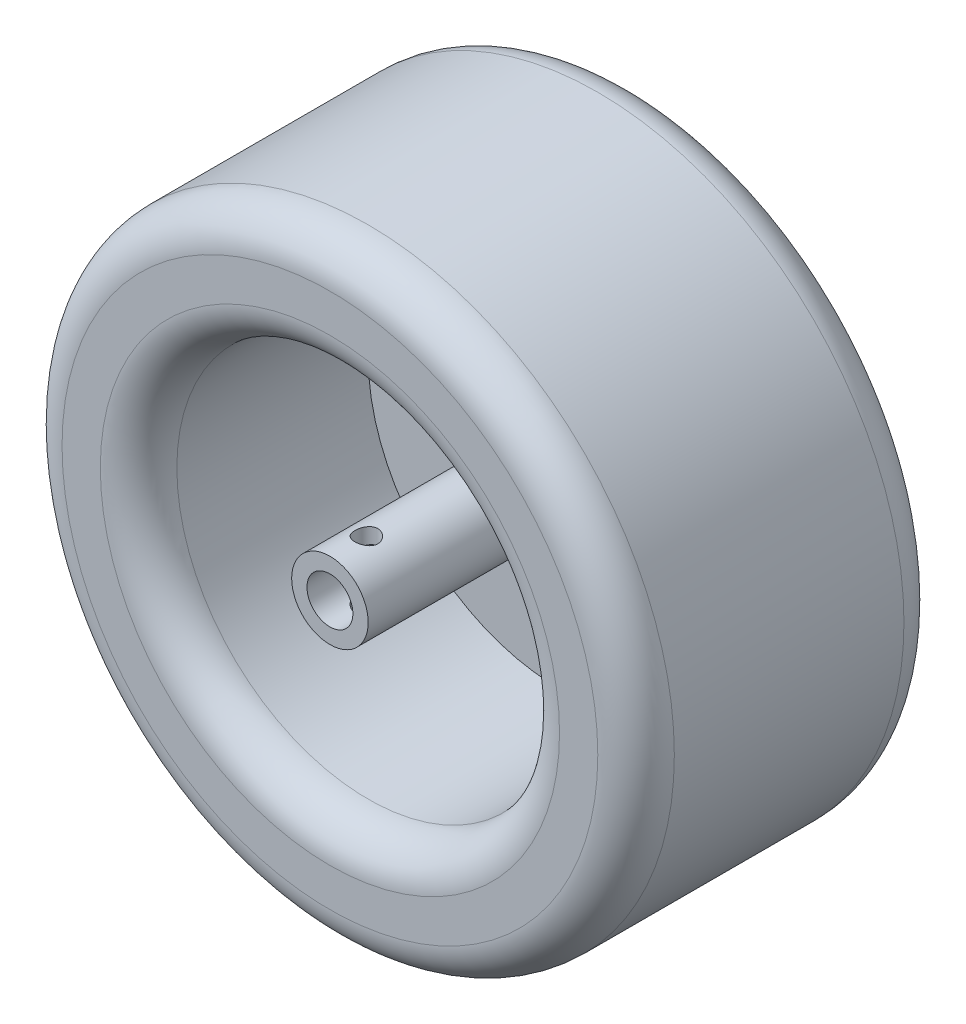
ISO-10303-21;
HEADER;
FILE_DESCRIPTION(('STEP AP214'),'2;1');
FILE_NAME('part.step','',(''),(''),'','','');
FILE_SCHEMA(('AUTOMOTIVE_DESIGN { 1 0 10303 214 1 1 1 1 }'));
ENDSEC;
DATA;
#1=APPLICATION_CONTEXT('core data for automotive mechanical design processes');
#2=APPLICATION_PROTOCOL_DEFINITION('international standard','automotive_design',2000,#1);
#3=PRODUCT_CONTEXT('',#1,'mechanical');
#4=PRODUCT('Part','Part','',(#3));
#5=PRODUCT_RELATED_PRODUCT_CATEGORY('part','',(#4));
#6=PRODUCT_DEFINITION_FORMATION('','',#4);
#7=PRODUCT_DEFINITION_CONTEXT('part definition',#1,'design');
#8=PRODUCT_DEFINITION('design','',#6,#7);
#9=PRODUCT_DEFINITION_SHAPE('','',#8);
#10=(LENGTH_UNIT() NAMED_UNIT(*) SI_UNIT(.MILLI.,.METRE.));
#11=(NAMED_UNIT(*) PLANE_ANGLE_UNIT() SI_UNIT($,.RADIAN.));
#12=(NAMED_UNIT(*) SI_UNIT($,.STERADIAN.) SOLID_ANGLE_UNIT());
#13=UNCERTAINTY_MEASURE_WITH_UNIT(LENGTH_MEASURE(1.E-05),#10,'distance_accuracy_value','');
#14=(GEOMETRIC_REPRESENTATION_CONTEXT(3) GLOBAL_UNCERTAINTY_ASSIGNED_CONTEXT((#13)) GLOBAL_UNIT_ASSIGNED_CONTEXT((#10,
#11,#12)) REPRESENTATION_CONTEXT('',''));
#15=CARTESIAN_POINT('',(0.,0.,0.));
#16=DIRECTION('',(0.,0.,1.));
#17=DIRECTION('',(1.,0.,0.));
#18=AXIS2_PLACEMENT_3D('',#15,#16,#17);
#19=CARTESIAN_POINT('',(0.,0.,35.));
#20=DIRECTION('',(0.,0.,-1.));
#21=DIRECTION('',(-1.,0.,0.));
#22=AXIS2_PLACEMENT_3D('',#19,#20,#21);
#23=CYLINDRICAL_SURFACE('',#22,5.);
#24=CARTESIAN_POINT('',(0.,0.,35.));
#25=DIRECTION('',(0.,0.,1.));
#26=DIRECTION('',(1.,0.,0.));
#27=AXIS2_PLACEMENT_3D('',#24,#25,#26);
#28=CIRCLE('',#27,5.);
#29=CARTESIAN_POINT('',(5.,0.,35.));
#30=VERTEX_POINT('',#29);
#31=EDGE_CURVE('E147',#30,#30,#28,.T.);
#32=ORIENTED_EDGE('',*,*,#31,.F.);
#33=EDGE_LOOP('',(#32));
#34=FACE_BOUND('',#33,.T.);
#35=CARTESIAN_POINT('',(0.,0.,5.));
#36=DIRECTION('',(0.,0.,-1.));
#37=DIRECTION('',(-1.,0.,0.));
#38=AXIS2_PLACEMENT_3D('',#35,#36,#37);
#39=CIRCLE('',#38,5.);
#40=CARTESIAN_POINT('',(-5.,0.,5.));
#41=VERTEX_POINT('',#40);
#42=EDGE_CURVE('E152',#41,#41,#39,.F.);
#43=ORIENTED_EDGE('',*,*,#42,.T.);
#44=EDGE_LOOP('',(#43));
#45=FACE_BOUND('',#44,.T.);
#46=CARTESIAN_POINT('',(0.,-5.,28.7430607778996));
#47=CARTESIAN_POINT('',(0.0822886127532998,-4.9999992925055,28.7430617753845));
#48=CARTESIAN_POINT('',(0.164587318351529,-4.99794915693954,28.7498546415236));
#49=CARTESIAN_POINT('',(0.32678812530488,-4.98997105593691,28.7767821321217));
#50=CARTESIAN_POINT('',(0.406689504411419,-4.98404193389692,28.796920735923));
#51=CARTESIAN_POINT('',(0.561732707754526,-4.96895552501836,28.8498067948099));
#52=CARTESIAN_POINT('',(0.636881364395373,-4.95980300250425,28.8825356475186));
#53=CARTESIAN_POINT('',(0.780624181053131,-4.93922109237645,28.9595968709555));
#54=CARTESIAN_POINT('',(0.849217467469668,-4.92779140192067,29.003930785295));
#55=CARTESIAN_POINT('',(0.979871797183743,-4.90350737192774,29.1042847853723));
#56=CARTESIAN_POINT('',(1.04171807124434,-4.89062383657036,29.1605774037855));
#57=CARTESIAN_POINT('',(1.15524920923324,-4.86505834210442,29.2826700078098));
#58=CARTESIAN_POINT('',(1.20693236327441,-4.85237641724501,29.3484715900246));
#59=CARTESIAN_POINT('',(1.29980037723708,-4.82834113993772,29.4895315309372));
#60=CARTESIAN_POINT('',(1.34072309022213,-4.81702406663875,29.5649692388904));
#61=CARTESIAN_POINT('',(1.4092139477476,-4.79743620394031,29.7220500321299));
#62=CARTESIAN_POINT('',(1.43678529919973,-4.78916468313311,29.8036916218276));
#63=CARTESIAN_POINT('',(1.47701633682652,-4.77690870838434,29.9684510440301));
#64=CARTESIAN_POINT('',(1.49007196234677,-4.77281069324533,30.0514635217636));
#65=CARTESIAN_POINT('',(1.50213730614672,-4.76902789749767,30.2185939341164));
#66=CARTESIAN_POINT('',(1.50115042761078,-4.76934204760571,30.3027115959587));
#67=CARTESIAN_POINT('',(1.48546977199812,-4.77424744067778,30.4664446865081));
#68=CARTESIAN_POINT('',(1.47127205262685,-4.7786838859914,30.5461130282619));
#69=CARTESIAN_POINT('',(1.43037420427056,-4.79108356228624,30.7018805641731));
#70=CARTESIAN_POINT('',(1.40367284141641,-4.79904714132351,30.777979405274));
#71=CARTESIAN_POINT('',(1.33816026653682,-4.81772733074973,30.9256611275604));
#72=CARTESIAN_POINT('',(1.29918816934642,-4.82848016115952,30.9971678618549));
#73=CARTESIAN_POINT('',(1.21035222588683,-4.85150987000065,31.1327927999098));
#74=CARTESIAN_POINT('',(1.16048574002588,-4.86378711746991,31.1969092073134));
#75=CARTESIAN_POINT('',(1.04881290765546,-4.88911011297937,31.3187469686616));
#76=CARTESIAN_POINT('',(0.986594907466972,-4.90216654310498,31.3760894419293));
#77=CARTESIAN_POINT('',(0.853263259313969,-4.92712244063259,31.4796147619639));
#78=CARTESIAN_POINT('',(0.782149051860891,-4.9390218351841,31.5257969063141));
#79=CARTESIAN_POINT('',(0.632355038342807,-4.9604316006947,31.6059207003644));
#80=CARTESIAN_POINT('',(0.553627749747954,-4.96992543668314,31.6397782941495));
#81=CARTESIAN_POINT('',(0.391245415603522,-4.98533521832222,31.6936603679993));
#82=CARTESIAN_POINT('',(0.307591751589583,-4.99125216186999,31.7136887064321));
#83=CARTESIAN_POINT('',(0.140952242668331,-4.99868364643538,31.738712955799));
#84=CARTESIAN_POINT('',(0.0580500976011863,-5.0003485041779,31.7442223637012));
#85=CARTESIAN_POINT('',(-0.107499605823384,-4.9995292324176,31.7414916221875));
#86=CARTESIAN_POINT('',(-0.190147196690781,-4.99704565677756,31.7332533082482));
#87=CARTESIAN_POINT('',(-0.350903605309697,-4.98830696987163,31.7036761667881));
#88=CARTESIAN_POINT('',(-0.42907277261417,-4.98213829799417,31.6826373903188));
#89=CARTESIAN_POINT('',(-0.580754638954523,-4.96674347841532,31.6284175451214));
#90=CARTESIAN_POINT('',(-0.654266777025584,-4.95751696321085,31.5952350168618));
#91=CARTESIAN_POINT('',(-0.796437189461053,-4.93669654351325,31.5168076124185));
#92=CARTESIAN_POINT('',(-0.864943826199672,-4.92505280829675,31.4713014369516));
#93=CARTESIAN_POINT('',(-0.993523307980149,-4.90073468764318,31.3698360238468));
#94=CARTESIAN_POINT('',(-1.05359403235593,-4.8880600443108,31.313874166012));
#95=CARTESIAN_POINT('',(-1.16585744551027,-4.86253171869138,31.1906734695303));
#96=CARTESIAN_POINT('',(-1.21768481231504,-4.84968825033268,31.1230989021279));
#97=CARTESIAN_POINT('',(-1.30928995072154,-4.82576515238463,30.9799328388861));
#98=CARTESIAN_POINT('',(-1.34906803829472,-4.81468547654651,30.9043415533414));
#99=CARTESIAN_POINT('',(-1.41517347127168,-4.79567189615055,30.7475282866449));
#100=CARTESIAN_POINT('',(-1.4415634693705,-4.78772337843827,30.666334591363));
#101=CARTESIAN_POINT('',(-1.48021730815114,-4.77591594362794,30.5003728089681));
#102=CARTESIAN_POINT('',(-1.49248598978779,-4.772055625083,30.415605957112));
#103=CARTESIAN_POINT('',(-1.50221984485059,-4.76899972496087,30.2486992595234));
#104=CARTESIAN_POINT('',(-1.5002805530849,-4.76961647442754,30.166597126882));
#105=CARTESIAN_POINT('',(-1.48307505444813,-4.77499401288294,30.0039466745268));
#106=CARTESIAN_POINT('',(-1.46780938124716,-4.77975463592551,29.9233982927233));
#107=CARTESIAN_POINT('',(-1.42476888804136,-4.79275763670385,29.7671153787568));
#108=CARTESIAN_POINT('',(-1.39715175507069,-4.80095604545965,29.6913334905379));
#109=CARTESIAN_POINT('',(-1.33031507121129,-4.81990278909136,29.5454183390819));
#110=CARTESIAN_POINT('',(-1.29109329962876,-4.83065161194312,29.4752861602589));
#111=CARTESIAN_POINT('',(-1.20048763805072,-4.85397676425833,29.3398976613725));
#112=CARTESIAN_POINT('',(-1.14871276092994,-4.86660540163797,29.2749120166392));
#113=CARTESIAN_POINT('',(-1.03517434629782,-4.89201320450026,29.1543582795918));
#114=CARTESIAN_POINT('',(-0.973408217134503,-4.90479240823905,29.0987926384319));
#115=CARTESIAN_POINT('',(-0.83946576218325,-4.92950936570649,28.9970373656046));
#116=CARTESIAN_POINT('',(-0.767037885790609,-4.94141159765674,28.9511693310441));
#117=CARTESIAN_POINT('',(-0.615141373983531,-4.96260680455813,28.8723256079956));
#118=CARTESIAN_POINT('',(-0.535676052998956,-4.97190099931067,28.8393438896251));
#119=CARTESIAN_POINT('',(-0.380757712655282,-4.98602174969301,28.7901655022469));
#120=CARTESIAN_POINT('',(-0.305786961954234,-4.99122027381068,28.7725491050164));
#121=CARTESIAN_POINT('',(-0.15388019523078,-4.99820944494492,28.7489972526581));
#122=CARTESIAN_POINT('',(-0.0769445098581397,-5.0000006615474,28.7430598451948));
#123=CARTESIAN_POINT('',(0.,-5.,28.7430607778996));
#124=B_SPLINE_CURVE_WITH_KNOTS('',3,(#46,#47,#48,#49,#50,#51,#52,#53,#54,#55,#56,#57,#58,#59,
#60,#61,#62,#63,#64,#65,#66,#67,#68,#69,#70,#71,#72,#73,#74,#75,#76,#77,#78,#79,#80,#81,#82,#83,
#84,#85,#86,#87,#88,#89,#90,#91,#92,#93,#94,#95,#96,#97,#98,#99,#100,#101,#102,#103,#104,#105,
#106,#107,#108,#109,#110,#111,#112,#113,#114,#115,#116,#117,#118,#119,#120,#121,#122,#123),
.UNSPECIFIED.,.T.,.F.,(4,2,2,2,2,2,2,2,2,2,2,2,2,2,2,2,2,2,2,2,2,2,2,2,2,2,2,2,2,2,2,2,2,2,2,2,
2,2,4),(0.,0.24658320361261,0.493239964845999,0.739533676300874,0.985860164412701,
1.23855602948191,1.49129437288633,1.74971481004109,2.00807314543224,2.25919689356599,
2.51025978319089,2.75226016697676,2.99428443658001,3.2396242644712,3.48502360158556,
3.74067104048167,3.99633456531071,4.25371046881688,4.51101453528808,4.75908809438545,
5.00712853550327,5.24956746682327,5.49203554593729,5.74011305702909,5.98825282000191,
6.24540400322819,6.5025484425268,6.75847814951252,7.01432009460283,7.25950155466943,
7.504673196616,7.74680040402721,7.98897397553107,8.2399692567993,8.49102974897502,
8.74942996156671,9.00770911595235,9.2383169193046,9.46888616948875),.UNSPECIFIED.);
#125=CARTESIAN_POINT('',(0.,-5.,28.7430607778996));
#126=VERTEX_POINT('',#125);
#127=EDGE_CURVE('E87',#126,#126,#124,.T.);
#128=ORIENTED_EDGE('',*,*,#127,.F.);
#129=EDGE_LOOP('',(#128));
#130=FACE_BOUND('',#129,.T.);
#131=CARTESIAN_POINT('',(0.,5.,28.7430607778996));
#132=CARTESIAN_POINT('',(-0.0822886127532998,4.9999992925055,28.7430617753845));
#133=CARTESIAN_POINT('',(-0.164587318351529,4.99794915693954,28.7498546415236));
#134=CARTESIAN_POINT('',(-0.32678812530488,4.98997105593691,28.7767821321217));
#135=CARTESIAN_POINT('',(-0.406689504411419,4.98404193389692,28.796920735923));
#136=CARTESIAN_POINT('',(-0.561732707754526,4.96895552501836,28.8498067948099));
#137=CARTESIAN_POINT('',(-0.636881364395373,4.95980300250425,28.8825356475186));
#138=CARTESIAN_POINT('',(-0.780624181053131,4.93922109237645,28.9595968709555));
#139=CARTESIAN_POINT('',(-0.849217467469668,4.92779140192067,29.003930785295));
#140=CARTESIAN_POINT('',(-0.979871797183743,4.90350737192774,29.1042847853723));
#141=CARTESIAN_POINT('',(-1.04171807124434,4.89062383657036,29.1605774037855));
#142=CARTESIAN_POINT('',(-1.15524920923324,4.86505834210442,29.2826700078098));
#143=CARTESIAN_POINT('',(-1.20693236327441,4.85237641724501,29.3484715900246));
#144=CARTESIAN_POINT('',(-1.29980037723708,4.82834113993772,29.4895315309372));
#145=CARTESIAN_POINT('',(-1.34072309022213,4.81702406663875,29.5649692388904));
#146=CARTESIAN_POINT('',(-1.4092139477476,4.79743620394031,29.7220500321299));
#147=CARTESIAN_POINT('',(-1.43678529919973,4.78916468313311,29.8036916218276));
#148=CARTESIAN_POINT('',(-1.47701633682652,4.77690870838434,29.9684510440301));
#149=CARTESIAN_POINT('',(-1.49007196234677,4.77281069324533,30.0514635217636));
#150=CARTESIAN_POINT('',(-1.50213730614672,4.76902789749767,30.2185939341164));
#151=CARTESIAN_POINT('',(-1.50115042761078,4.76934204760571,30.3027115959587));
#152=CARTESIAN_POINT('',(-1.48546977199812,4.77424744067778,30.4664446865081));
#153=CARTESIAN_POINT('',(-1.47127205262685,4.7786838859914,30.5461130282619));
#154=CARTESIAN_POINT('',(-1.43037420427056,4.79108356228624,30.7018805641731));
#155=CARTESIAN_POINT('',(-1.40367284141641,4.79904714132351,30.777979405274));
#156=CARTESIAN_POINT('',(-1.33816026653682,4.81772733074973,30.9256611275604));
#157=CARTESIAN_POINT('',(-1.29918816934642,4.82848016115952,30.9971678618549));
#158=CARTESIAN_POINT('',(-1.21035222588683,4.85150987000065,31.1327927999098));
#159=CARTESIAN_POINT('',(-1.16048574002588,4.86378711746991,31.1969092073134));
#160=CARTESIAN_POINT('',(-1.04881290765546,4.88911011297937,31.3187469686616));
#161=CARTESIAN_POINT('',(-0.986594907466972,4.90216654310498,31.3760894419293));
#162=CARTESIAN_POINT('',(-0.853263259313969,4.92712244063259,31.4796147619639));
#163=CARTESIAN_POINT('',(-0.782149051860891,4.9390218351841,31.5257969063141));
#164=CARTESIAN_POINT('',(-0.632355038342807,4.9604316006947,31.6059207003644));
#165=CARTESIAN_POINT('',(-0.553627749747954,4.96992543668314,31.6397782941495));
#166=CARTESIAN_POINT('',(-0.391245415603522,4.98533521832222,31.6936603679993));
#167=CARTESIAN_POINT('',(-0.307591751589583,4.99125216186999,31.7136887064321));
#168=CARTESIAN_POINT('',(-0.140952242668331,4.99868364643538,31.738712955799));
#169=CARTESIAN_POINT('',(-0.0580500976011863,5.0003485041779,31.7442223637012));
#170=CARTESIAN_POINT('',(0.107499605823384,4.9995292324176,31.7414916221875));
#171=CARTESIAN_POINT('',(0.190147196690781,4.99704565677756,31.7332533082482));
#172=CARTESIAN_POINT('',(0.350903605309697,4.98830696987163,31.7036761667881));
#173=CARTESIAN_POINT('',(0.42907277261417,4.98213829799417,31.6826373903188));
#174=CARTESIAN_POINT('',(0.580754638954523,4.96674347841532,31.6284175451214));
#175=CARTESIAN_POINT('',(0.654266777025584,4.95751696321085,31.5952350168618));
#176=CARTESIAN_POINT('',(0.796437189461053,4.93669654351325,31.5168076124185));
#177=CARTESIAN_POINT('',(0.864943826199672,4.92505280829675,31.4713014369516));
#178=CARTESIAN_POINT('',(0.993523307980149,4.90073468764318,31.3698360238468));
#179=CARTESIAN_POINT('',(1.05359403235593,4.8880600443108,31.313874166012));
#180=CARTESIAN_POINT('',(1.16585744551027,4.86253171869138,31.1906734695303));
#181=CARTESIAN_POINT('',(1.21768481231504,4.84968825033268,31.1230989021279));
#182=CARTESIAN_POINT('',(1.30928995072154,4.82576515238463,30.9799328388861));
#183=CARTESIAN_POINT('',(1.34906803829472,4.81468547654651,30.9043415533414));
#184=CARTESIAN_POINT('',(1.41517347127168,4.79567189615055,30.7475282866449));
#185=CARTESIAN_POINT('',(1.4415634693705,4.78772337843827,30.666334591363));
#186=CARTESIAN_POINT('',(1.48021730815114,4.77591594362794,30.5003728089681));
#187=CARTESIAN_POINT('',(1.49248598978779,4.772055625083,30.415605957112));
#188=CARTESIAN_POINT('',(1.50221984485059,4.76899972496087,30.2486992595234));
#189=CARTESIAN_POINT('',(1.5002805530849,4.76961647442754,30.166597126882));
#190=CARTESIAN_POINT('',(1.48307505444813,4.77499401288294,30.0039466745268));
#191=CARTESIAN_POINT('',(1.46780938124716,4.77975463592551,29.9233982927233));
#192=CARTESIAN_POINT('',(1.42476888804136,4.79275763670385,29.7671153787568));
#193=CARTESIAN_POINT('',(1.39715175507069,4.80095604545965,29.6913334905379));
#194=CARTESIAN_POINT('',(1.33031507121129,4.81990278909136,29.5454183390819));
#195=CARTESIAN_POINT('',(1.29109329962876,4.83065161194312,29.4752861602589));
#196=CARTESIAN_POINT('',(1.20048763805072,4.85397676425833,29.3398976613725));
#197=CARTESIAN_POINT('',(1.14871276092994,4.86660540163797,29.2749120166392));
#198=CARTESIAN_POINT('',(1.03517434629782,4.89201320450026,29.1543582795918));
#199=CARTESIAN_POINT('',(0.973408217134503,4.90479240823905,29.0987926384319));
#200=CARTESIAN_POINT('',(0.83946576218325,4.92950936570649,28.9970373656046));
#201=CARTESIAN_POINT('',(0.767037885790609,4.94141159765674,28.9511693310441));
#202=CARTESIAN_POINT('',(0.615141373983531,4.96260680455813,28.8723256079956));
#203=CARTESIAN_POINT('',(0.535676052998956,4.97190099931067,28.8393438896251));
#204=CARTESIAN_POINT('',(0.380757712655282,4.98602174969301,28.7901655022469));
#205=CARTESIAN_POINT('',(0.305786961954234,4.99122027381068,28.7725491050164));
#206=CARTESIAN_POINT('',(0.15388019523078,4.99820944494492,28.7489972526581));
#207=CARTESIAN_POINT('',(0.0769445098581397,5.0000006615474,28.7430598451948));
#208=CARTESIAN_POINT('',(0.,5.,28.7430607778996));
#209=B_SPLINE_CURVE_WITH_KNOTS('',3,(#131,#132,#133,#134,#135,#136,#137,#138,#139,#140,#141,
#142,#143,#144,#145,#146,#147,#148,#149,#150,#151,#152,#153,#154,#155,#156,#157,#158,#159,#160,
#161,#162,#163,#164,#165,#166,#167,#168,#169,#170,#171,#172,#173,#174,#175,#176,#177,#178,#179,
#180,#181,#182,#183,#184,#185,#186,#187,#188,#189,#190,#191,#192,#193,#194,#195,#196,#197,#198,
#199,#200,#201,#202,#203,#204,#205,#206,#207,#208),.UNSPECIFIED.,.T.,.F.,(4,2,2,2,2,2,2,2,2,2,2,
2,2,2,2,2,2,2,2,2,2,2,2,2,2,2,2,2,2,2,2,2,2,2,2,2,2,2,4),(0.,0.24658320361261,0.493239964845999,
0.739533676300874,0.985860164412701,1.23855602948191,1.49129437288633,1.74971481004109,
2.00807314543224,2.25919689356599,2.51025978319089,2.75226016697676,2.99428443658001,
3.2396242644712,3.48502360158556,3.74067104048167,3.99633456531071,4.25371046881688,
4.51101453528808,4.75908809438545,5.00712853550327,5.24956746682327,5.49203554593729,
5.74011305702909,5.98825282000191,6.24540400322819,6.5025484425268,6.75847814951252,
7.01432009460283,7.25950155466943,7.504673196616,7.74680040402721,7.98897397553107,
8.2399692567993,8.49102974897502,8.74942996156671,9.00770911595235,9.2383169193046,
9.46888616948875),.UNSPECIFIED.);
#210=CARTESIAN_POINT('',(0.,5.,28.7430607778996));
#211=VERTEX_POINT('',#210);
#212=EDGE_CURVE('E67',#211,#211,#209,.T.);
#213=ORIENTED_EDGE('',*,*,#212,.F.);
#214=EDGE_LOOP('',(#213));
#215=FACE_BOUND('',#214,.T.);
#216=ADVANCED_FACE('F39',(#34,#45,#130,#215),#23,.T.);
#217=CARTESIAN_POINT('',(0.,0.,35.));
#218=DIRECTION('',(0.,0.,-1.));
#219=DIRECTION('',(-1.,0.,0.));
#220=AXIS2_PLACEMENT_3D('',#217,#218,#219);
#221=CYLINDRICAL_SURFACE('',#220,3.);
#222=CARTESIAN_POINT('',(0.,-3.,28.7430607778996));
#223=CARTESIAN_POINT('',(0.0788579444268501,-2.99999570107562,28.7430657313754));
#224=CARTESIAN_POINT('',(0.157809899546344,-2.99685736529635,28.7493158875812));
#225=CARTESIAN_POINT('',(0.313380352903344,-2.98461234055736,28.7740400984119));
#226=CARTESIAN_POINT('',(0.389994130070444,-2.97549431743379,28.7925373673963));
#227=CARTESIAN_POINT('',(0.538400317320673,-2.95224419105063,28.8408514908246));
#228=CARTESIAN_POINT('',(0.610210204408719,-2.93813158766306,28.8706243542716));
#229=CARTESIAN_POINT('',(0.747708925209897,-2.90618664773642,28.9404167099471));
#230=CARTESIAN_POINT('',(0.813398240985088,-2.88835460450288,28.9804353942729));
#231=CARTESIAN_POINT('',(0.941261726642864,-2.84934387387093,29.0723366521276));
#232=CARTESIAN_POINT('',(1.00298281668316,-2.82802798691306,29.1247904967591));
#233=CARTESIAN_POINT('',(1.11716916730047,-2.78489955370115,29.2388429967702));
#234=CARTESIAN_POINT('',(1.16962737466015,-2.76308664313552,29.3004485555583));
#235=CARTESIAN_POINT('',(1.26787800067542,-2.71948426796021,29.4367858021847));
#236=CARTESIAN_POINT('',(1.31283800332746,-2.69782780455198,29.5121649254185));
#237=CARTESIAN_POINT('',(1.38925234033604,-2.65928968158481,29.6706117818789));
#238=CARTESIAN_POINT('',(1.4207163224495,-2.64240461410484,29.7536739709838));
#239=CARTESIAN_POINT('',(1.46719866328288,-2.61686800556713,29.9200584360325));
#240=CARTESIAN_POINT('',(1.48308878562066,-2.6077840737557,30.0030674560007));
#241=CARTESIAN_POINT('',(1.50064048996327,-2.59772834922792,30.1710290345688));
#242=CARTESIAN_POINT('',(1.50231613255961,-2.59674854014932,30.2559795892064));
#243=CARTESIAN_POINT('',(1.49203093075844,-2.60266395385873,30.4144898143727));
#244=CARTESIAN_POINT('',(1.48167683930523,-2.6086314549302,30.4881968247342));
#245=CARTESIAN_POINT('',(1.4504097735854,-2.62614343100776,30.6326436419592));
#246=CARTESIAN_POINT('',(1.42949343584648,-2.63768968247665,30.7033824958576));
#247=CARTESIAN_POINT('',(1.37731467057901,-2.66531214619112,30.8419044767481));
#248=CARTESIAN_POINT('',(1.34582260067399,-2.68148760995998,30.9095803760783));
#249=CARTESIAN_POINT('',(1.273562531502,-2.71655106422106,31.0390122167846));
#250=CARTESIAN_POINT('',(1.2327903657187,-2.73544027170286,31.1007654812998));
#251=CARTESIAN_POINT('',(1.13709908236918,-2.77669736854929,31.2248426570145));
#252=CARTESIAN_POINT('',(1.08104168755392,-2.79920265355119,31.2862460882639));
#253=CARTESIAN_POINT('',(0.95933336811206,-2.84321434950611,31.399163905786));
#254=CARTESIAN_POINT('',(0.893677884861427,-2.86472027938201,31.4506735659505));
#255=CARTESIAN_POINT('',(0.75077475874777,-2.90552980924446,31.5445892694442));
#256=CARTESIAN_POINT('',(0.67313038739911,-2.92468476243011,31.5864614865682));
#257=CARTESIAN_POINT('',(0.510699323233192,-2.95736821681864,31.6562063214641));
#258=CARTESIAN_POINT('',(0.425918364397912,-2.9709011841533,31.6840900554224));
#259=CARTESIAN_POINT('',(0.259149737491053,-2.98986500612153,31.7227738834746));
#260=CARTESIAN_POINT('',(0.17751229582249,-2.99587407451965,31.7347976315198));
#261=CARTESIAN_POINT('',(0.0131693999240292,-3.00109520188655,31.7452578746014));
#262=CARTESIAN_POINT('',(-0.0695355298048608,-3.00031048081978,31.7437008063588));
#263=CARTESIAN_POINT('',(-0.226849457978977,-2.99236788380153,31.7277507452715));
#264=CARTESIAN_POINT('',(-0.301589112074891,-2.98570868532253,31.7143619788046));
#265=CARTESIAN_POINT('',(-0.447610338452908,-2.9673325697226,31.6767036700569));
#266=CARTESIAN_POINT('',(-0.518891528536628,-2.95561509501618,31.6524329282194));
#267=CARTESIAN_POINT('',(-0.658332912674358,-2.92776377120382,31.5930630782501));
#268=CARTESIAN_POINT('',(-0.726345595508703,-2.91151322654446,31.5576742027252));
#269=CARTESIAN_POINT('',(-0.855692042548906,-2.87615961476127,31.4773994744298));
#270=CARTESIAN_POINT('',(-0.917022944664887,-2.85705533350407,31.4325095760065));
#271=CARTESIAN_POINT('',(-1.03765153393382,-2.81562332004297,31.3294201399036));
#272=CARTESIAN_POINT('',(-1.09615811672854,-2.79316327265249,31.2703464752319));
#273=CARTESIAN_POINT('',(-1.20278448167828,-2.7489358741323,31.143173050983));
#274=CARTESIAN_POINT('',(-1.25089707856781,-2.72716901100071,31.0750670996277));
#275=CARTESIAN_POINT('',(-1.33756187171852,-2.68576788309734,30.9275952966402));
#276=CARTESIAN_POINT('',(-1.37553824370037,-2.66628794383591,30.8478438787579));
#277=CARTESIAN_POINT('',(-1.43712423890205,-2.63361108441202,30.6817956765372));
#278=CARTESIAN_POINT('',(-1.46075237380052,-2.62040607332625,30.5955074881993));
#279=CARTESIAN_POINT('',(-1.49079253120031,-2.60342251538703,30.4276954435726));
#280=CARTESIAN_POINT('',(-1.49863949460818,-2.59886075197597,30.3465093977468));
#281=CARTESIAN_POINT('',(-1.5010337315643,-2.59748031962405,30.1838901771528));
#282=CARTESIAN_POINT('',(-1.49558676993486,-2.60065829439585,30.1024571247928));
#283=CARTESIAN_POINT('',(-1.47288918838996,-2.61356793076615,29.9498355255995));
#284=CARTESIAN_POINT('',(-1.45681247151455,-2.62264641723988,29.8784100726825));
#285=CARTESIAN_POINT('',(-1.41476303733662,-2.64556524281479,29.7393485987631));
#286=CARTESIAN_POINT('',(-1.38878713673988,-2.65940711354503,29.6717138047616));
#287=CARTESIAN_POINT('',(-1.32572361795085,-2.69142795546803,29.5371235014198));
#288=CARTESIAN_POINT('',(-1.28800670672355,-2.70983583593881,29.4705189251561));
#289=CARTESIAN_POINT('',(-1.20322645745609,-2.74852997452291,29.3441489736277));
#290=CARTESIAN_POINT('',(-1.15615825686234,-2.76881720693416,29.284387182118));
#291=CARTESIAN_POINT('',(-1.04730498999206,-2.81193484737138,29.1658478043676));
#292=CARTESIAN_POINT('',(-0.984426634495893,-2.83477474959942,29.1080721243742));
#293=CARTESIAN_POINT('',(-0.849232209349798,-2.87816628389896,29.0036663027467));
#294=CARTESIAN_POINT('',(-0.776911084957798,-2.89871667939293,28.9570421686948));
#295=CARTESIAN_POINT('',(-0.623897395174421,-2.93547014349806,28.8762062338315));
#296=CARTESIAN_POINT('',(-0.543149255665097,-2.95164144740899,28.8420845240449));
#297=CARTESIAN_POINT('',(-0.376113151707131,-2.9775201194848,28.7883485262635));
#298=CARTESIAN_POINT('',(-0.289841699383651,-2.98724585044602,28.7686930076911));
#299=CARTESIAN_POINT('',(-0.168902919736343,-2.99543192870217,28.752214661271));
#300=CARTESIAN_POINT('',(-0.135242819162348,-2.99714048010376,28.7487868166001));
#301=CARTESIAN_POINT('',(-0.0677275977076379,-2.99942545465223,28.7442087796285));
#302=CARTESIAN_POINT('',(-0.0338724714699429,-3.00000184655071,28.7430586501943));
#303=CARTESIAN_POINT('',(0.,-3.,28.7430607778996));
#304=B_SPLINE_CURVE_WITH_KNOTS('',3,(#222,#223,#224,#225,#226,#227,#228,#229,#230,#231,#232,
#233,#234,#235,#236,#237,#238,#239,#240,#241,#242,#243,#244,#245,#246,#247,#248,#249,#250,#251,
#252,#253,#254,#255,#256,#257,#258,#259,#260,#261,#262,#263,#264,#265,#266,#267,#268,#269,#270,
#271,#272,#273,#274,#275,#276,#277,#278,#279,#280,#281,#282,#283,#284,#285,#286,#287,#288,#289,
#290,#291,#292,#293,#294,#295,#296,#297,#298,#299,#300,#301,#302,#303),.UNSPECIFIED.,.T.,.F.,(4,
2,2,2,2,2,2,2,2,2,2,2,2,2,2,2,2,2,2,2,2,2,2,2,2,2,2,2,2,2,2,2,2,2,2,2,2,2,2,2,4),(0.,
0.236436386130438,0.473322224563797,0.709293233238447,0.945245640872351,1.19547263807713,
1.44588935648105,1.71572589646129,1.98536921847421,2.23887018210344,2.49212035993531,
2.71508568613981,2.93812205888518,3.16635360252731,3.39468781890332,3.65197412000818,
3.9093830189803,4.17874533321661,4.4478932536842,4.69474935707018,4.94148846767214,
5.16910359759183,5.39674382446397,5.63089284041848,5.86514176122509,6.12239415966628,
6.37982382923147,6.64972023242588,6.91926767918176,7.16293961254569,7.40650589797018,
7.62686895373284,7.84730293182526,8.08254685170431,8.31791341715446,8.58187864135757,
8.84598575071869,9.1119602049529,9.37717362931724,9.47872920200875,9.58028757766599),.UNSPECIFIED.);
#305=CARTESIAN_POINT('',(0.,-3.,28.7430607778996));
#306=VERTEX_POINT('',#305);
#307=EDGE_CURVE('E68',#306,#306,#304,.T.);
#308=ORIENTED_EDGE('',*,*,#307,.T.);
#309=EDGE_LOOP('',(#308));
#310=FACE_BOUND('',#309,.T.);
#311=CARTESIAN_POINT('',(0.,0.,35.));
#312=DIRECTION('',(0.,0.,1.));
#313=DIRECTION('',(1.,0.,0.));
#314=AXIS2_PLACEMENT_3D('',#311,#312,#313);
#315=CIRCLE('',#314,3.);
#316=CARTESIAN_POINT('',(3.,0.,35.));
#317=VERTEX_POINT('',#316);
#318=EDGE_CURVE('E155',#317,#317,#315,.T.);
#319=ORIENTED_EDGE('',*,*,#318,.T.);
#320=EDGE_LOOP('',(#319));
#321=FACE_BOUND('',#320,.T.);
#322=CARTESIAN_POINT('',(0.,0.,5.));
#323=DIRECTION('',(0.,0.,1.));
#324=DIRECTION('',(1.,0.,0.));
#325=AXIS2_PLACEMENT_3D('',#322,#323,#324);
#326=CIRCLE('',#325,3.);
#327=CARTESIAN_POINT('',(3.,0.,5.));
#328=VERTEX_POINT('',#327);
#329=EDGE_CURVE('E66',#328,#328,#326,.T.);
#330=ORIENTED_EDGE('',*,*,#329,.F.);
#331=EDGE_LOOP('',(#330));
#332=FACE_BOUND('',#331,.T.);
#333=CARTESIAN_POINT('',(0.,3.,28.7430607778996));
#334=CARTESIAN_POINT('',(-0.0788579444268501,2.99999570107562,28.7430657313754));
#335=CARTESIAN_POINT('',(-0.157809899546344,2.99685736529635,28.7493158875812));
#336=CARTESIAN_POINT('',(-0.313380352903344,2.98461234055736,28.7740400984119));
#337=CARTESIAN_POINT('',(-0.389994130070444,2.97549431743379,28.7925373673963));
#338=CARTESIAN_POINT('',(-0.538400317320673,2.95224419105063,28.8408514908246));
#339=CARTESIAN_POINT('',(-0.610210204408719,2.93813158766306,28.8706243542716));
#340=CARTESIAN_POINT('',(-0.747708925209897,2.90618664773642,28.9404167099471));
#341=CARTESIAN_POINT('',(-0.813398240985088,2.88835460450288,28.9804353942729));
#342=CARTESIAN_POINT('',(-0.941261726642864,2.84934387387093,29.0723366521276));
#343=CARTESIAN_POINT('',(-1.00298281668316,2.82802798691306,29.1247904967591));
#344=CARTESIAN_POINT('',(-1.11716916730047,2.78489955370115,29.2388429967702));
#345=CARTESIAN_POINT('',(-1.16962737466015,2.76308664313552,29.3004485555583));
#346=CARTESIAN_POINT('',(-1.26787800067542,2.71948426796021,29.4367858021847));
#347=CARTESIAN_POINT('',(-1.31283800332746,2.69782780455198,29.5121649254185));
#348=CARTESIAN_POINT('',(-1.38925234033604,2.65928968158481,29.6706117818789));
#349=CARTESIAN_POINT('',(-1.4207163224495,2.64240461410484,29.7536739709838));
#350=CARTESIAN_POINT('',(-1.46719866328288,2.61686800556713,29.9200584360325));
#351=CARTESIAN_POINT('',(-1.48308878562066,2.6077840737557,30.0030674560007));
#352=CARTESIAN_POINT('',(-1.50064048996327,2.59772834922792,30.1710290345688));
#353=CARTESIAN_POINT('',(-1.50231613255961,2.59674854014932,30.2559795892064));
#354=CARTESIAN_POINT('',(-1.49203093075844,2.60266395385873,30.4144898143727));
#355=CARTESIAN_POINT('',(-1.48167683930523,2.6086314549302,30.4881968247342));
#356=CARTESIAN_POINT('',(-1.4504097735854,2.62614343100776,30.6326436419592));
#357=CARTESIAN_POINT('',(-1.42949343584648,2.63768968247665,30.7033824958576));
#358=CARTESIAN_POINT('',(-1.37731467057901,2.66531214619112,30.8419044767481));
#359=CARTESIAN_POINT('',(-1.34582260067399,2.68148760995998,30.9095803760783));
#360=CARTESIAN_POINT('',(-1.273562531502,2.71655106422106,31.0390122167846));
#361=CARTESIAN_POINT('',(-1.2327903657187,2.73544027170286,31.1007654812998));
#362=CARTESIAN_POINT('',(-1.13709908236918,2.77669736854929,31.2248426570145));
#363=CARTESIAN_POINT('',(-1.08104168755392,2.79920265355119,31.2862460882639));
#364=CARTESIAN_POINT('',(-0.95933336811206,2.84321434950611,31.399163905786));
#365=CARTESIAN_POINT('',(-0.893677884861427,2.86472027938201,31.4506735659505));
#366=CARTESIAN_POINT('',(-0.75077475874777,2.90552980924446,31.5445892694442));
#367=CARTESIAN_POINT('',(-0.67313038739911,2.92468476243011,31.5864614865682));
#368=CARTESIAN_POINT('',(-0.510699323233192,2.95736821681864,31.6562063214641));
#369=CARTESIAN_POINT('',(-0.425918364397912,2.9709011841533,31.6840900554224));
#370=CARTESIAN_POINT('',(-0.259149737491053,2.98986500612153,31.7227738834746));
#371=CARTESIAN_POINT('',(-0.17751229582249,2.99587407451965,31.7347976315198));
#372=CARTESIAN_POINT('',(-0.0131693999240292,3.00109520188655,31.7452578746014));
#373=CARTESIAN_POINT('',(0.0695355298048608,3.00031048081978,31.7437008063588));
#374=CARTESIAN_POINT('',(0.226849457978977,2.99236788380153,31.7277507452715));
#375=CARTESIAN_POINT('',(0.301589112074891,2.98570868532253,31.7143619788046));
#376=CARTESIAN_POINT('',(0.447610338452908,2.9673325697226,31.6767036700569));
#377=CARTESIAN_POINT('',(0.518891528536628,2.95561509501618,31.6524329282194));
#378=CARTESIAN_POINT('',(0.658332912674358,2.92776377120382,31.5930630782501));
#379=CARTESIAN_POINT('',(0.726345595508703,2.91151322654446,31.5576742027252));
#380=CARTESIAN_POINT('',(0.855692042548906,2.87615961476127,31.4773994744298));
#381=CARTESIAN_POINT('',(0.917022944664887,2.85705533350407,31.4325095760065));
#382=CARTESIAN_POINT('',(1.03765153393382,2.81562332004297,31.3294201399036));
#383=CARTESIAN_POINT('',(1.09615811672854,2.79316327265249,31.2703464752319));
#384=CARTESIAN_POINT('',(1.20278448167828,2.7489358741323,31.143173050983));
#385=CARTESIAN_POINT('',(1.25089707856781,2.72716901100071,31.0750670996277));
#386=CARTESIAN_POINT('',(1.33756187171852,2.68576788309734,30.9275952966402));
#387=CARTESIAN_POINT('',(1.37553824370037,2.66628794383591,30.8478438787579));
#388=CARTESIAN_POINT('',(1.43712423890205,2.63361108441202,30.6817956765372));
#389=CARTESIAN_POINT('',(1.46075237380052,2.62040607332625,30.5955074881993));
#390=CARTESIAN_POINT('',(1.49079253120031,2.60342251538703,30.4276954435726));
#391=CARTESIAN_POINT('',(1.49863949460818,2.59886075197597,30.3465093977468));
#392=CARTESIAN_POINT('',(1.5010337315643,2.59748031962405,30.1838901771528));
#393=CARTESIAN_POINT('',(1.49558676993486,2.60065829439585,30.1024571247928));
#394=CARTESIAN_POINT('',(1.47288918838996,2.61356793076615,29.9498355255995));
#395=CARTESIAN_POINT('',(1.45681247151455,2.62264641723988,29.8784100726825));
#396=CARTESIAN_POINT('',(1.41476303733662,2.64556524281479,29.7393485987631));
#397=CARTESIAN_POINT('',(1.38878713673988,2.65940711354503,29.6717138047616));
#398=CARTESIAN_POINT('',(1.32572361795085,2.69142795546803,29.5371235014198));
#399=CARTESIAN_POINT('',(1.28800670672355,2.70983583593881,29.4705189251561));
#400=CARTESIAN_POINT('',(1.20322645745609,2.74852997452291,29.3441489736277));
#401=CARTESIAN_POINT('',(1.15615825686234,2.76881720693416,29.284387182118));
#402=CARTESIAN_POINT('',(1.04730498999206,2.81193484737138,29.1658478043676));
#403=CARTESIAN_POINT('',(0.984426634495893,2.83477474959942,29.1080721243742));
#404=CARTESIAN_POINT('',(0.849232209349798,2.87816628389896,29.0036663027467));
#405=CARTESIAN_POINT('',(0.776911084957798,2.89871667939293,28.9570421686948));
#406=CARTESIAN_POINT('',(0.623897395174421,2.93547014349806,28.8762062338315));
#407=CARTESIAN_POINT('',(0.543149255665097,2.95164144740899,28.8420845240449));
#408=CARTESIAN_POINT('',(0.376113151707131,2.9775201194848,28.7883485262635));
#409=CARTESIAN_POINT('',(0.289841699383651,2.98724585044602,28.7686930076911));
#410=CARTESIAN_POINT('',(0.168902919736343,2.99543192870217,28.752214661271));
#411=CARTESIAN_POINT('',(0.135242819162348,2.99714048010376,28.7487868166001));
#412=CARTESIAN_POINT('',(0.0677275977076379,2.99942545465223,28.7442087796285));
#413=CARTESIAN_POINT('',(0.0338724714699429,3.00000184655071,28.7430586501943));
#414=CARTESIAN_POINT('',(0.,3.,28.7430607778996));
#415=B_SPLINE_CURVE_WITH_KNOTS('',3,(#333,#334,#335,#336,#337,#338,#339,#340,#341,#342,#343,
#344,#345,#346,#347,#348,#349,#350,#351,#352,#353,#354,#355,#356,#357,#358,#359,#360,#361,#362,
#363,#364,#365,#366,#367,#368,#369,#370,#371,#372,#373,#374,#375,#376,#377,#378,#379,#380,#381,
#382,#383,#384,#385,#386,#387,#388,#389,#390,#391,#392,#393,#394,#395,#396,#397,#398,#399,#400,
#401,#402,#403,#404,#405,#406,#407,#408,#409,#410,#411,#412,#413,#414),.UNSPECIFIED.,.T.,.F.,(4,
2,2,2,2,2,2,2,2,2,2,2,2,2,2,2,2,2,2,2,2,2,2,2,2,2,2,2,2,2,2,2,2,2,2,2,2,2,2,2,4),(0.,
0.236436386130438,0.473322224563797,0.709293233238447,0.945245640872351,1.19547263807713,
1.44588935648105,1.71572589646129,1.98536921847421,2.23887018210344,2.49212035993531,
2.71508568613981,2.93812205888518,3.16635360252731,3.39468781890332,3.65197412000818,
3.9093830189803,4.17874533321661,4.4478932536842,4.69474935707018,4.94148846767214,
5.16910359759183,5.39674382446397,5.63089284041848,5.86514176122509,6.12239415966628,
6.37982382923147,6.64972023242588,6.91926767918176,7.16293961254569,7.40650589797018,
7.62686895373284,7.84730293182526,8.08254685170431,8.31791341715446,8.58187864135757,
8.84598575071869,9.1119602049529,9.37717362931724,9.47872920200875,9.58028757766599),.UNSPECIFIED.);
#416=CARTESIAN_POINT('',(0.,3.,28.7430607778996));
#417=VERTEX_POINT('',#416);
#418=EDGE_CURVE('E43',#417,#417,#415,.T.);
#419=ORIENTED_EDGE('',*,*,#418,.T.);
#420=EDGE_LOOP('',(#419));
#421=FACE_BOUND('',#420,.T.);
#422=ADVANCED_FACE('F74',(#310,#321,#332,#421),#221,.F.);
#423=CARTESIAN_POINT('',(0.,0.,35.));
#424=DIRECTION('',(0.,0.,-1.));
#425=DIRECTION('',(-1.,0.,0.));
#426=AXIS2_PLACEMENT_3D('',#423,#424,#425);
#427=CYLINDRICAL_SURFACE('',#426,25.);
#428=CARTESIAN_POINT('',(0.,0.,30.));
#429=DIRECTION('',(0.,0.,1.));
#430=DIRECTION('',(1.,0.,0.));
#431=AXIS2_PLACEMENT_3D('',#428,#429,#430);
#432=CIRCLE('',#431,25.);
#433=CARTESIAN_POINT('',(25.,0.,30.));
#434=VERTEX_POINT('',#433);
#435=EDGE_CURVE('E10',#434,#434,#432,.T.);
#436=ORIENTED_EDGE('',*,*,#435,.T.);
#437=EDGE_LOOP('',(#436));
#438=FACE_BOUND('',#437,.T.);
#439=CARTESIAN_POINT('',(0.,0.,5.));
#440=DIRECTION('',(0.,0.,-1.));
#441=DIRECTION('',(-1.,0.,0.));
#442=AXIS2_PLACEMENT_3D('',#439,#440,#441);
#443=CIRCLE('',#442,25.);
#444=CARTESIAN_POINT('',(-25.,0.,5.));
#445=VERTEX_POINT('',#444);
#446=EDGE_CURVE('E146',#445,#445,#443,.T.);
#447=ORIENTED_EDGE('',*,*,#446,.T.);
#448=EDGE_LOOP('',(#447));
#449=FACE_BOUND('',#448,.T.);
#450=ADVANCED_FACE('F111',(#438,#449),#427,.F.);
#451=CARTESIAN_POINT('',(0.,0.,35.));
#452=DIRECTION('',(0.,0.,1.));
#453=DIRECTION('',(1.,0.,0.));
#454=AXIS2_PLACEMENT_3D('',#451,#452,#453);
#455=PLANE('',#454);
#456=CARTESIAN_POINT('',(0.,0.,35.));
#457=DIRECTION('',(0.,0.,1.));
#458=DIRECTION('',(1.,0.,0.));
#459=AXIS2_PLACEMENT_3D('',#456,#457,#458);
#460=CIRCLE('',#459,35.);
#461=CARTESIAN_POINT('',(35.,0.,35.));
#462=VERTEX_POINT('',#461);
#463=EDGE_CURVE('E166',#462,#462,#460,.T.);
#464=ORIENTED_EDGE('',*,*,#463,.T.);
#465=EDGE_LOOP('',(#464));
#466=FACE_BOUND('',#465,.T.);
#467=CARTESIAN_POINT('',(0.,0.,35.));
#468=DIRECTION('',(0.,0.,1.));
#469=DIRECTION('',(1.,0.,0.));
#470=AXIS2_PLACEMENT_3D('',#467,#468,#469);
#471=CIRCLE('',#470,30.);
#472=CARTESIAN_POINT('',(30.,0.,35.));
#473=VERTEX_POINT('',#472);
#474=EDGE_CURVE('E162',#473,#473,#471,.F.);
#475=ORIENTED_EDGE('',*,*,#474,.T.);
#476=EDGE_LOOP('',(#475));
#477=FACE_BOUND('',#476,.T.);
#478=ADVANCED_FACE('F114',(#466,#477),#455,.T.);
#479=CARTESIAN_POINT('',(0.,0.,35.));
#480=DIRECTION('',(0.,0.,-1.));
#481=DIRECTION('',(-1.,0.,0.));
#482=AXIS2_PLACEMENT_3D('',#479,#480,#481);
#483=CYLINDRICAL_SURFACE('',#482,40.);
#484=CARTESIAN_POINT('',(0.,0.,30.));
#485=DIRECTION('',(0.,0.,1.));
#486=DIRECTION('',(1.,0.,0.));
#487=AXIS2_PLACEMENT_3D('',#484,#485,#486);
#488=CIRCLE('',#487,40.);
#489=CARTESIAN_POINT('',(40.,0.,30.));
#490=VERTEX_POINT('',#489);
#491=EDGE_CURVE('E53',#490,#490,#488,.F.);
#492=ORIENTED_EDGE('',*,*,#491,.T.);
#493=EDGE_LOOP('',(#492));
#494=FACE_BOUND('',#493,.T.);
#495=CARTESIAN_POINT('',(0.,0.,0.));
#496=DIRECTION('',(0.,0.,-1.));
#497=DIRECTION('',(-1.,0.,0.));
#498=AXIS2_PLACEMENT_3D('',#495,#496,#497);
#499=CIRCLE('',#498,40.);
#500=CARTESIAN_POINT('',(-40.,0.,0.));
#501=VERTEX_POINT('',#500);
#502=EDGE_CURVE('E59',#501,#501,#499,.F.);
#503=ORIENTED_EDGE('',*,*,#502,.T.);
#504=EDGE_LOOP('',(#503));
#505=FACE_BOUND('',#504,.T.);
#506=ADVANCED_FACE('F108',(#494,#505),#483,.T.);
#507=CARTESIAN_POINT('',(0.,0.,5.));
#508=DIRECTION('',(0.,0.,-1.));
#509=DIRECTION('',(-1.,0.,0.));
#510=AXIS2_PLACEMENT_3D('',#507,#508,#509);
#511=PLANE('',#510);
#512=ORIENTED_EDGE('',*,*,#42,.F.);
#513=EDGE_LOOP('',(#512));
#514=FACE_BOUND('',#513,.T.);
#515=ORIENTED_EDGE('',*,*,#446,.F.);
#516=EDGE_LOOP('',(#515));
#517=FACE_BOUND('',#516,.T.);
#518=ADVANCED_FACE('F103',(#514,#517),#511,.F.);
#519=CARTESIAN_POINT('',(0.,0.,0.));
#520=DIRECTION('',(0.,0.,1.));
#521=DIRECTION('',(1.,0.,0.));
#522=AXIS2_PLACEMENT_3D('',#519,#520,#521);
#523=PLANE('',#522);
#524=CARTESIAN_POINT('',(0.,0.,0.));
#525=DIRECTION('',(0.,0.,-1.));
#526=DIRECTION('',(-1.,0.,0.));
#527=AXIS2_PLACEMENT_3D('',#524,#525,#526);
#528=CIRCLE('',#527,30.);
#529=CARTESIAN_POINT('',(-30.,0.,0.));
#530=VERTEX_POINT('',#529);
#531=EDGE_CURVE('E144',#530,#530,#528,.T.);
#532=ORIENTED_EDGE('',*,*,#531,.T.);
#533=EDGE_LOOP('',(#532));
#534=FACE_BOUND('',#533,.T.);
#535=ADVANCED_FACE('F107',(#534),#523,.F.);
#536=CARTESIAN_POINT('',(0.,0.,35.));
#537=DIRECTION('',(0.,0.,1.));
#538=DIRECTION('',(1.,0.,0.));
#539=AXIS2_PLACEMENT_3D('',#536,#537,#538);
#540=PLANE('',#539);
#541=ORIENTED_EDGE('',*,*,#31,.T.);
#542=EDGE_LOOP('',(#541));
#543=FACE_BOUND('',#542,.T.);
#544=ORIENTED_EDGE('',*,*,#318,.F.);
#545=EDGE_LOOP('',(#544));
#546=FACE_BOUND('',#545,.T.);
#547=ADVANCED_FACE('F102',(#543,#546),#540,.T.);
#548=ORIENTED_EDGE('',*,*,#329,.T.);
#549=EDGE_LOOP('',(#548));
#550=FACE_BOUND('',#549,.T.);
#551=ADVANCED_FACE('F110',(#550),#511,.F.);
#552=CARTESIAN_POINT('',(0.,0.,30.));
#553=DIRECTION('',(0.,0.,1.));
#554=DIRECTION('',(1.,0.,0.));
#555=AXIS2_PLACEMENT_3D('',#552,#553,#554);
#556=TOROIDAL_SURFACE('',#555,35.,5.);
#557=ORIENTED_EDGE('',*,*,#491,.F.);
#558=EDGE_LOOP('',(#557));
#559=FACE_BOUND('',#558,.T.);
#560=ORIENTED_EDGE('',*,*,#463,.F.);
#561=EDGE_LOOP('',(#560));
#562=FACE_BOUND('',#561,.T.);
#563=ADVANCED_FACE('F124',(#559,#562),#556,.T.);
#564=CARTESIAN_POINT('',(0.,0.,30.));
#565=DIRECTION('',(0.,0.,1.));
#566=DIRECTION('',(1.,0.,0.));
#567=AXIS2_PLACEMENT_3D('',#564,#565,#566);
#568=TOROIDAL_SURFACE('',#567,30.,5.);
#569=ORIENTED_EDGE('',*,*,#474,.F.);
#570=EDGE_LOOP('',(#569));
#571=FACE_BOUND('',#570,.T.);
#572=ORIENTED_EDGE('',*,*,#435,.F.);
#573=EDGE_LOOP('',(#572));
#574=FACE_BOUND('',#573,.T.);
#575=ADVANCED_FACE('F127',(#571,#574),#568,.T.);
#576=CARTESIAN_POINT('',(0.,0.,0.));
#577=DIRECTION('',(0.,0.,-1.));
#578=DIRECTION('',(-1.,0.,0.));
#579=AXIS2_PLACEMENT_3D('',#576,#577,#578);
#580=TOROIDAL_SURFACE('',#579,35.,5.);
#581=ORIENTED_EDGE('',*,*,#502,.F.);
#582=EDGE_LOOP('',(#581));
#583=FACE_BOUND('',#582,.T.);
#584=CARTESIAN_POINT('',(0.,0.,-5.));
#585=DIRECTION('',(0.,0.,-1.));
#586=DIRECTION('',(-1.,0.,0.));
#587=AXIS2_PLACEMENT_3D('',#584,#585,#586);
#588=CIRCLE('',#587,35.);
#589=CARTESIAN_POINT('',(-35.,0.,-5.));
#590=VERTEX_POINT('',#589);
#591=EDGE_CURVE('E63',#590,#590,#588,.T.);
#592=ORIENTED_EDGE('',*,*,#591,.F.);
#593=EDGE_LOOP('',(#592));
#594=FACE_BOUND('',#593,.T.);
#595=ADVANCED_FACE('F41',(#583,#594),#580,.T.);
#596=CARTESIAN_POINT('',(0.,0.,0.));
#597=DIRECTION('',(0.,0.,-1.));
#598=DIRECTION('',(-1.,0.,0.));
#599=AXIS2_PLACEMENT_3D('',#596,#597,#598);
#600=TOROIDAL_SURFACE('',#599,35.,5.);
#601=ORIENTED_EDGE('',*,*,#591,.T.);
#602=EDGE_LOOP('',(#601));
#603=FACE_BOUND('',#602,.T.);
#604=ORIENTED_EDGE('',*,*,#531,.F.);
#605=EDGE_LOOP('',(#604));
#606=FACE_BOUND('',#605,.T.);
#607=ADVANCED_FACE('F131',(#603,#606),#600,.T.);
#608=CARTESIAN_POINT('',(0.,10.,30.2430607778996));
#609=DIRECTION('',(0.,-1.,0.));
#610=DIRECTION('',(0.,0.,-1.));
#611=AXIS2_PLACEMENT_3D('',#608,#609,#610);
#612=CYLINDRICAL_SURFACE('',#611,1.5);
#613=ORIENTED_EDGE('',*,*,#307,.F.);
#614=EDGE_LOOP('',(#613));
#615=FACE_BOUND('',#614,.T.);
#616=ORIENTED_EDGE('',*,*,#127,.T.);
#617=EDGE_LOOP('',(#616));
#618=FACE_BOUND('',#617,.T.);
#619=ADVANCED_FACE('F80',(#615,#618),#612,.F.);
#620=ORIENTED_EDGE('',*,*,#418,.F.);
#621=EDGE_LOOP('',(#620));
#622=FACE_BOUND('',#621,.T.);
#623=ORIENTED_EDGE('',*,*,#212,.T.);
#624=EDGE_LOOP('',(#623));
#625=FACE_BOUND('',#624,.T.);
#626=ADVANCED_FACE('F77',(#622,#625),#612,.F.);
#627=CLOSED_SHELL('',(#216,#422,#450,#478,#506,#518,#535,#547,#551,#563,#575,#595,#607,#619,#626));
#628=MANIFOLD_SOLID_BREP('B2',#627);
#629=ADVANCED_BREP_SHAPE_REPRESENTATION('',(#18,#628),#14);
#630=SHAPE_DEFINITION_REPRESENTATION(#9,#629);
ENDSEC;
END-ISO-10303-21;
